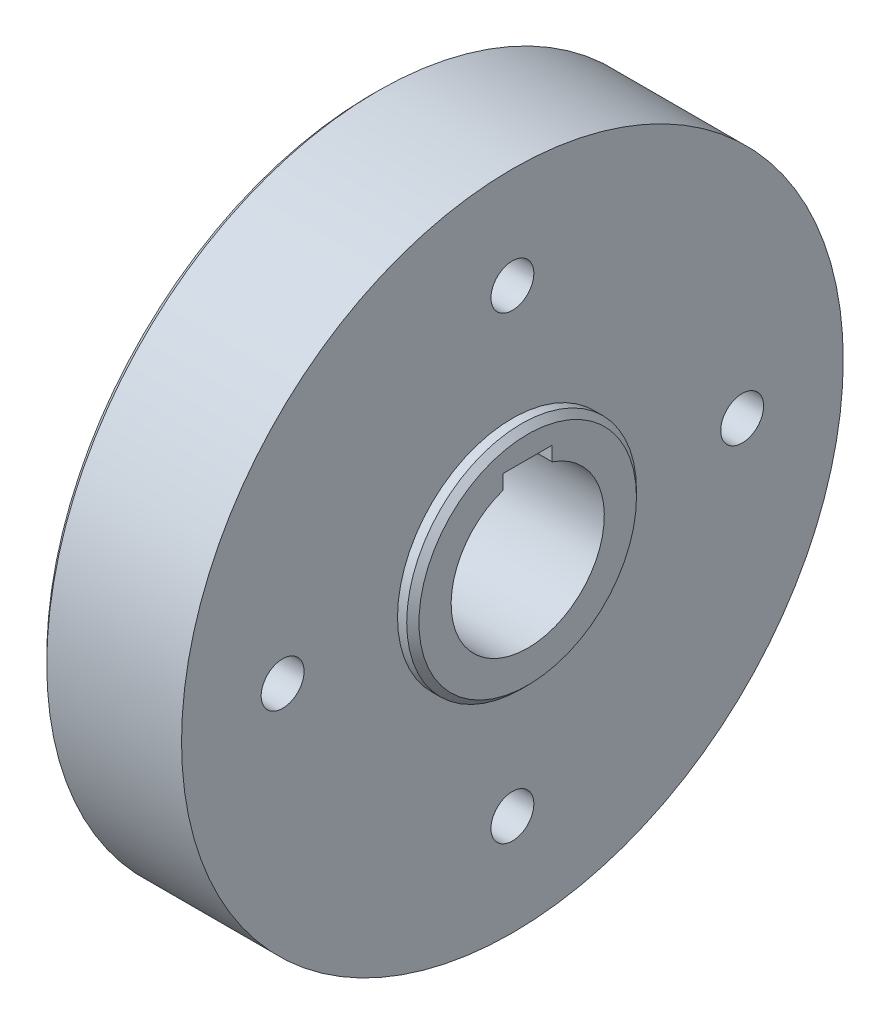
ISO-10303-21;
HEADER;
FILE_DESCRIPTION(('STEP AP214'),'2;1');
FILE_NAME('part.step','',(''),(''),'','','');
FILE_SCHEMA(('AUTOMOTIVE_DESIGN { 1 0 10303 214 1 1 1 1 }'));
ENDSEC;
DATA;
#1=APPLICATION_CONTEXT('core data for automotive mechanical design processes');
#2=APPLICATION_PROTOCOL_DEFINITION('international standard','automotive_design',2000,#1);
#3=PRODUCT_CONTEXT('',#1,'mechanical');
#4=PRODUCT('Part','Part','',(#3));
#5=PRODUCT_RELATED_PRODUCT_CATEGORY('part','',(#4));
#6=PRODUCT_DEFINITION_FORMATION('','',#4);
#7=PRODUCT_DEFINITION_CONTEXT('part definition',#1,'design');
#8=PRODUCT_DEFINITION('design','',#6,#7);
#9=PRODUCT_DEFINITION_SHAPE('','',#8);
#10=(LENGTH_UNIT() NAMED_UNIT(*) SI_UNIT(.MILLI.,.METRE.));
#11=(NAMED_UNIT(*) PLANE_ANGLE_UNIT() SI_UNIT($,.RADIAN.));
#12=(NAMED_UNIT(*) SI_UNIT($,.STERADIAN.) SOLID_ANGLE_UNIT());
#13=UNCERTAINTY_MEASURE_WITH_UNIT(LENGTH_MEASURE(1.E-05),#10,'distance_accuracy_value','');
#14=(GEOMETRIC_REPRESENTATION_CONTEXT(3) GLOBAL_UNCERTAINTY_ASSIGNED_CONTEXT((#13)) GLOBAL_UNIT_ASSIGNED_CONTEXT((#10,
#11,#12)) REPRESENTATION_CONTEXT('',''));
#15=CARTESIAN_POINT('',(0.,0.,0.));
#16=DIRECTION('',(0.,0.,1.));
#17=DIRECTION('',(1.,0.,0.));
#18=AXIS2_PLACEMENT_3D('',#15,#16,#17);
#19=CARTESIAN_POINT('',(15.,0.,0.));
#20=DIRECTION('',(1.,0.,0.));
#21=DIRECTION('',(0.,0.,-1.));
#22=AXIS2_PLACEMENT_3D('',#19,#20,#21);
#23=PLANE('',#22);
#24=CARTESIAN_POINT('',(15.,0.,0.));
#25=DIRECTION('',(1.,0.,0.));
#26=DIRECTION('',(0.,0.,-1.));
#27=AXIS2_PLACEMENT_3D('',#24,#25,#26);
#28=CIRCLE('',#27,52.);
#29=CARTESIAN_POINT('',(15.,0.,-52.));
#30=VERTEX_POINT('',#29);
#31=EDGE_CURVE('E163',#30,#30,#28,.T.);
#32=ORIENTED_EDGE('',*,*,#31,.T.);
#33=EDGE_LOOP('',(#32));
#34=FACE_BOUND('',#33,.T.);
#35=CARTESIAN_POINT('',(15.,0.,75.));
#36=DIRECTION('',(1.,0.,0.));
#37=DIRECTION('',(0.,0.,-1.));
#38=AXIS2_PLACEMENT_3D('',#35,#36,#37);
#39=CIRCLE('',#38,6.99999999999997);
#40=CARTESIAN_POINT('',(15.,0.,68.));
#41=VERTEX_POINT('',#40);
#42=EDGE_CURVE('E138',#41,#41,#39,.T.);
#43=ORIENTED_EDGE('',*,*,#42,.T.);
#44=EDGE_LOOP('',(#43));
#45=FACE_BOUND('',#44,.T.);
#46=CARTESIAN_POINT('',(15.,-75.,0.));
#47=DIRECTION('',(1.,0.,0.));
#48=DIRECTION('',(0.,0.,-1.));
#49=AXIS2_PLACEMENT_3D('',#46,#47,#48);
#50=CIRCLE('',#49,6.99999999999996);
#51=CARTESIAN_POINT('',(15.,-75.,-6.99999999999995));
#52=VERTEX_POINT('',#51);
#53=EDGE_CURVE('E134',#52,#52,#50,.T.);
#54=ORIENTED_EDGE('',*,*,#53,.T.);
#55=EDGE_LOOP('',(#54));
#56=FACE_BOUND('',#55,.T.);
#57=CARTESIAN_POINT('',(15.,0.,-75.));
#58=DIRECTION('',(1.,0.,0.));
#59=DIRECTION('',(0.,0.,-1.));
#60=AXIS2_PLACEMENT_3D('',#57,#58,#59);
#61=CIRCLE('',#60,6.99999999999997);
#62=CARTESIAN_POINT('',(15.,0.,-81.9999999999999));
#63=VERTEX_POINT('',#62);
#64=EDGE_CURVE('E128',#63,#63,#61,.T.);
#65=ORIENTED_EDGE('',*,*,#64,.T.);
#66=EDGE_LOOP('',(#65));
#67=FACE_BOUND('',#66,.T.);
#68=CARTESIAN_POINT('',(15.,75.,0.));
#69=DIRECTION('',(1.,0.,0.));
#70=DIRECTION('',(0.,0.,-1.));
#71=AXIS2_PLACEMENT_3D('',#68,#69,#70);
#72=CIRCLE('',#71,6.99999999999996);
#73=CARTESIAN_POINT('',(15.,75.,-6.99999999999996));
#74=VERTEX_POINT('',#73);
#75=EDGE_CURVE('E122',#74,#74,#72,.T.);
#76=ORIENTED_EDGE('',*,*,#75,.T.);
#77=EDGE_LOOP('',(#76));
#78=FACE_BOUND('',#77,.T.);
#79=CARTESIAN_POINT('',(15.,0.,0.));
#80=DIRECTION('',(1.,0.,0.));
#81=DIRECTION('',(0.,0.,-1.));
#82=AXIS2_PLACEMENT_3D('',#79,#80,#81);
#83=CIRCLE('',#82,100.);
#84=CARTESIAN_POINT('',(15.,0.,-100.));
#85=VERTEX_POINT('',#84);
#86=EDGE_CURVE('E150',#85,#85,#83,.T.);
#87=ORIENTED_EDGE('',*,*,#86,.F.);
#88=EDGE_LOOP('',(#87));
#89=FACE_BOUND('',#88,.T.);
#90=ADVANCED_FACE('F48',(#34,#45,#56,#67,#78,#89),#23,.F.);
#91=CARTESIAN_POINT('',(-40.,0.,0.));
#92=DIRECTION('',(-1.,0.,0.));
#93=DIRECTION('',(0.,0.,1.));
#94=AXIS2_PLACEMENT_3D('',#91,#92,#93);
#95=CYLINDRICAL_SURFACE('',#94,25.);
#96=DIRECTION('',(-1.,0.,0.));
#97=VECTOR('',#96,1.);
#98=CARTESIAN_POINT('',(-40.,23.685438564654,-8.));
#99=LINE('',#98,#97);
#100=CARTESIAN_POINT('',(-40.,23.685438564654,-8.));
#101=VERTEX_POINT('',#100);
#102=CARTESIAN_POINT('',(45.,23.685438564654,-8.));
#103=VERTEX_POINT('',#102);
#104=EDGE_CURVE('E72',#101,#103,#99,.F.);
#105=ORIENTED_EDGE('',*,*,#104,.F.);
#106=CARTESIAN_POINT('',(-40.,0.,0.));
#107=DIRECTION('',(-1.,0.,0.));
#108=DIRECTION('',(0.,0.,1.));
#109=AXIS2_PLACEMENT_3D('',#106,#107,#108);
#110=CIRCLE('',#109,25.);
#111=CARTESIAN_POINT('',(-40.,23.685438564654,8.));
#112=VERTEX_POINT('',#111);
#113=EDGE_CURVE('E139',#101,#112,#110,.T.);
#114=ORIENTED_EDGE('',*,*,#113,.T.);
#115=DIRECTION('',(-1.,0.,0.));
#116=VECTOR('',#115,1.);
#117=CARTESIAN_POINT('',(-40.,23.685438564654,8.));
#118=LINE('',#117,#116);
#119=CARTESIAN_POINT('',(45.,23.685438564654,8.));
#120=VERTEX_POINT('',#119);
#121=EDGE_CURVE('E64',#112,#120,#118,.F.);
#122=ORIENTED_EDGE('',*,*,#121,.T.);
#123=CARTESIAN_POINT('',(45.,0.,0.));
#124=DIRECTION('',(-1.,0.,0.));
#125=DIRECTION('',(0.,0.,1.));
#126=AXIS2_PLACEMENT_3D('',#123,#124,#125);
#127=CIRCLE('',#126,25.);
#128=EDGE_CURVE('E148',#103,#120,#127,.T.);
#129=ORIENTED_EDGE('',*,*,#128,.F.);
#130=EDGE_LOOP('',(#105,#114,#122,#129));
#131=FACE_BOUND('',#130,.T.);
#132=ADVANCED_FACE('F190',(#131),#95,.F.);
#133=CARTESIAN_POINT('',(45.,0.,0.));
#134=DIRECTION('',(1.,0.,0.));
#135=DIRECTION('',(0.,0.,-1.));
#136=AXIS2_PLACEMENT_3D('',#133,#134,#135);
#137=PLANE('',#136);
#138=CARTESIAN_POINT('',(45.,0.,0.));
#139=DIRECTION('',(1.,0.,0.));
#140=DIRECTION('',(0.,0.,-1.));
#141=AXIS2_PLACEMENT_3D('',#138,#139,#140);
#142=CIRCLE('',#141,35.4999999999999);
#143=CARTESIAN_POINT('',(45.,0.,-35.4999999999999));
#144=VERTEX_POINT('',#143);
#145=EDGE_CURVE('E169',#144,#144,#142,.T.);
#146=ORIENTED_EDGE('',*,*,#145,.T.);
#147=EDGE_LOOP('',(#146));
#148=FACE_BOUND('',#147,.T.);
#149=DIRECTION('',(0.,1.,0.));
#150=VECTOR('',#149,1.);
#151=CARTESIAN_POINT('',(45.,0.,-8.));
#152=LINE('',#151,#150);
#153=CARTESIAN_POINT('',(45.,28.4,-8.));
#154=VERTEX_POINT('',#153);
#155=EDGE_CURVE('E88',#103,#154,#152,.T.);
#156=ORIENTED_EDGE('',*,*,#155,.F.);
#157=ORIENTED_EDGE('',*,*,#128,.T.);
#158=DIRECTION('',(0.,1.,0.));
#159=VECTOR('',#158,1.);
#160=CARTESIAN_POINT('',(45.,0.,8.));
#161=LINE('',#160,#159);
#162=CARTESIAN_POINT('',(45.,28.4,8.));
#163=VERTEX_POINT('',#162);
#164=EDGE_CURVE('E109',#120,#163,#161,.T.);
#165=ORIENTED_EDGE('',*,*,#164,.T.);
#166=DIRECTION('',(0.,0.,1.));
#167=VECTOR('',#166,1.);
#168=CARTESIAN_POINT('',(45.,28.4,-8.));
#169=LINE('',#168,#167);
#170=EDGE_CURVE('E102',#154,#163,#169,.T.);
#171=ORIENTED_EDGE('',*,*,#170,.F.);
#172=EDGE_LOOP('',(#156,#157,#165,#171));
#173=FACE_BOUND('',#172,.T.);
#174=ADVANCED_FACE('F108',(#148,#173),#137,.T.);
#175=CARTESIAN_POINT('',(-40.,0.,0.));
#176=DIRECTION('',(-1.,0.,0.));
#177=DIRECTION('',(0.,0.,1.));
#178=AXIS2_PLACEMENT_3D('',#175,#176,#177);
#179=CYLINDRICAL_SURFACE('',#178,37.5);
#180=CARTESIAN_POINT('',(42.9999999999999,0.,0.));
#181=DIRECTION('',(1.,0.,0.));
#182=DIRECTION('',(0.,0.,-1.));
#183=AXIS2_PLACEMENT_3D('',#180,#181,#182);
#184=CIRCLE('',#183,37.5);
#185=CARTESIAN_POINT('',(42.9999999999999,0.,-37.5));
#186=VERTEX_POINT('',#185);
#187=EDGE_CURVE('E166',#186,#186,#184,.F.);
#188=ORIENTED_EDGE('',*,*,#187,.T.);
#189=EDGE_LOOP('',(#188));
#190=FACE_BOUND('',#189,.T.);
#191=CARTESIAN_POINT('',(40.,0.,0.));
#192=DIRECTION('',(-1.,0.,0.));
#193=DIRECTION('',(0.,0.,1.));
#194=AXIS2_PLACEMENT_3D('',#191,#192,#193);
#195=CIRCLE('',#194,37.5);
#196=CARTESIAN_POINT('',(40.,0.,37.5));
#197=VERTEX_POINT('',#196);
#198=EDGE_CURVE('E145',#197,#197,#195,.T.);
#199=ORIENTED_EDGE('',*,*,#198,.F.);
#200=EDGE_LOOP('',(#199));
#201=FACE_BOUND('',#200,.T.);
#202=ADVANCED_FACE('F210',(#190,#201),#179,.T.);
#203=CARTESIAN_POINT('',(40.,0.,0.));
#204=DIRECTION('',(1.,0.,0.));
#205=DIRECTION('',(0.,0.,-1.));
#206=AXIS2_PLACEMENT_3D('',#203,#204,#205);
#207=PLANE('',#206);
#208=CARTESIAN_POINT('',(40.,75.,0.));
#209=DIRECTION('',(1.,0.,0.));
#210=DIRECTION('',(0.,0.,-1.));
#211=AXIS2_PLACEMENT_3D('',#208,#209,#210);
#212=CIRCLE('',#211,6.99999999999996);
#213=CARTESIAN_POINT('',(40.,75.,-6.99999999999996));
#214=VERTEX_POINT('',#213);
#215=EDGE_CURVE('E119',#214,#214,#212,.T.);
#216=ORIENTED_EDGE('',*,*,#215,.F.);
#217=EDGE_LOOP('',(#216));
#218=FACE_BOUND('',#217,.T.);
#219=CARTESIAN_POINT('',(40.,0.,-75.));
#220=DIRECTION('',(1.,0.,0.));
#221=DIRECTION('',(0.,0.,-1.));
#222=AXIS2_PLACEMENT_3D('',#219,#220,#221);
#223=CIRCLE('',#222,6.99999999999997);
#224=CARTESIAN_POINT('',(40.,0.,-81.9999999999999));
#225=VERTEX_POINT('',#224);
#226=EDGE_CURVE('E125',#225,#225,#223,.T.);
#227=ORIENTED_EDGE('',*,*,#226,.F.);
#228=EDGE_LOOP('',(#227));
#229=FACE_BOUND('',#228,.T.);
#230=CARTESIAN_POINT('',(40.,-75.,0.));
#231=DIRECTION('',(1.,0.,0.));
#232=DIRECTION('',(0.,0.,-1.));
#233=AXIS2_PLACEMENT_3D('',#230,#231,#232);
#234=CIRCLE('',#233,6.99999999999996);
#235=CARTESIAN_POINT('',(40.,-75.,-6.99999999999995));
#236=VERTEX_POINT('',#235);
#237=EDGE_CURVE('E131',#236,#236,#234,.T.);
#238=ORIENTED_EDGE('',*,*,#237,.F.);
#239=EDGE_LOOP('',(#238));
#240=FACE_BOUND('',#239,.T.);
#241=CARTESIAN_POINT('',(40.,0.,75.));
#242=DIRECTION('',(1.,0.,0.));
#243=DIRECTION('',(0.,0.,-1.));
#244=AXIS2_PLACEMENT_3D('',#241,#242,#243);
#245=CIRCLE('',#244,6.99999999999997);
#246=CARTESIAN_POINT('',(40.,0.,68.));
#247=VERTEX_POINT('',#246);
#248=EDGE_CURVE('E135',#247,#247,#245,.T.);
#249=ORIENTED_EDGE('',*,*,#248,.F.);
#250=EDGE_LOOP('',(#249));
#251=FACE_BOUND('',#250,.T.);
#252=ORIENTED_EDGE('',*,*,#198,.T.);
#253=EDGE_LOOP('',(#252));
#254=FACE_BOUND('',#253,.T.);
#255=CARTESIAN_POINT('',(40.,0.,0.));
#256=DIRECTION('',(-1.,0.,0.));
#257=DIRECTION('',(0.,0.,1.));
#258=AXIS2_PLACEMENT_3D('',#255,#256,#257);
#259=CIRCLE('',#258,108.);
#260=CARTESIAN_POINT('',(40.,0.,108.));
#261=VERTEX_POINT('',#260);
#262=EDGE_CURVE('E142',#261,#261,#259,.T.);
#263=ORIENTED_EDGE('',*,*,#262,.F.);
#264=EDGE_LOOP('',(#263));
#265=FACE_BOUND('',#264,.T.);
#266=ADVANCED_FACE('F206',(#218,#229,#240,#251,#254,#265),#207,.T.);
#267=CARTESIAN_POINT('',(-40.,0.,0.));
#268=DIRECTION('',(-1.,0.,0.));
#269=DIRECTION('',(0.,0.,1.));
#270=AXIS2_PLACEMENT_3D('',#267,#268,#269);
#271=CYLINDRICAL_SURFACE('',#270,108.);
#272=CARTESIAN_POINT('',(-3.99999999999998,0.,0.));
#273=DIRECTION('',(1.,0.,0.));
#274=DIRECTION('',(0.,0.,-1.));
#275=AXIS2_PLACEMENT_3D('',#272,#273,#274);
#276=CIRCLE('',#275,108.);
#277=CARTESIAN_POINT('',(-3.99999999999998,0.,-108.));
#278=VERTEX_POINT('',#277);
#279=EDGE_CURVE('E11',#278,#278,#276,.T.);
#280=ORIENTED_EDGE('',*,*,#279,.T.);
#281=EDGE_LOOP('',(#280));
#282=FACE_BOUND('',#281,.T.);
#283=ORIENTED_EDGE('',*,*,#262,.T.);
#284=EDGE_LOOP('',(#283));
#285=FACE_BOUND('',#284,.T.);
#286=ADVANCED_FACE('F203',(#282,#285),#271,.T.);
#287=CARTESIAN_POINT('',(-40.,0.,0.));
#288=DIRECTION('',(-1.,0.,0.));
#289=DIRECTION('',(0.,0.,1.));
#290=AXIS2_PLACEMENT_3D('',#287,#288,#289);
#291=CYLINDRICAL_SURFACE('',#290,50.);
#292=CARTESIAN_POINT('',(12.9999999999999,0.,0.));
#293=DIRECTION('',(1.,0.,0.));
#294=DIRECTION('',(0.,0.,-1.));
#295=AXIS2_PLACEMENT_3D('',#292,#293,#294);
#296=CIRCLE('',#295,50.);
#297=CARTESIAN_POINT('',(12.9999999999999,0.,-50.));
#298=VERTEX_POINT('',#297);
#299=EDGE_CURVE('E160',#298,#298,#296,.F.);
#300=ORIENTED_EDGE('',*,*,#299,.T.);
#301=EDGE_LOOP('',(#300));
#302=FACE_BOUND('',#301,.T.);
#303=CARTESIAN_POINT('',(-38.0000000000001,0.,0.));
#304=DIRECTION('',(1.,0.,0.));
#305=DIRECTION('',(0.,0.,-1.));
#306=AXIS2_PLACEMENT_3D('',#303,#304,#305);
#307=CIRCLE('',#306,50.);
#308=CARTESIAN_POINT('',(-38.0000000000001,0.,-50.));
#309=VERTEX_POINT('',#308);
#310=EDGE_CURVE('E157',#309,#309,#307,.T.);
#311=ORIENTED_EDGE('',*,*,#310,.T.);
#312=EDGE_LOOP('',(#311));
#313=FACE_BOUND('',#312,.T.);
#314=ADVANCED_FACE('F201',(#302,#313),#291,.T.);
#315=CARTESIAN_POINT('',(-40.,0.,0.));
#316=DIRECTION('',(1.,0.,0.));
#317=DIRECTION('',(0.,0.,-1.));
#318=AXIS2_PLACEMENT_3D('',#315,#316,#317);
#319=PLANE('',#318);
#320=CARTESIAN_POINT('',(-40.,0.,0.));
#321=DIRECTION('',(1.,0.,0.));
#322=DIRECTION('',(0.,0.,-1.));
#323=AXIS2_PLACEMENT_3D('',#320,#321,#322);
#324=CIRCLE('',#323,48.0000000000001);
#325=CARTESIAN_POINT('',(-40.,0.,-48.0000000000001));
#326=VERTEX_POINT('',#325);
#327=EDGE_CURVE('E172',#326,#326,#324,.F.);
#328=ORIENTED_EDGE('',*,*,#327,.T.);
#329=EDGE_LOOP('',(#328));
#330=FACE_BOUND('',#329,.T.);
#331=ORIENTED_EDGE('',*,*,#113,.F.);
#332=DIRECTION('',(0.,-1.,0.));
#333=VECTOR('',#332,1.);
#334=CARTESIAN_POINT('',(-40.,0.,-8.));
#335=LINE('',#334,#333);
#336=CARTESIAN_POINT('',(-40.,27.55,-8.));
#337=VERTEX_POINT('',#336);
#338=EDGE_CURVE('E97',#337,#101,#335,.T.);
#339=ORIENTED_EDGE('',*,*,#338,.F.);
#340=DIRECTION('',(0.,0.,1.));
#341=VECTOR('',#340,1.);
#342=CARTESIAN_POINT('',(-40.,27.55,-8.));
#343=LINE('',#342,#341);
#344=CARTESIAN_POINT('',(-40.,27.55,8.));
#345=VERTEX_POINT('',#344);
#346=EDGE_CURVE('E105',#337,#345,#343,.T.);
#347=ORIENTED_EDGE('',*,*,#346,.T.);
#348=DIRECTION('',(0.,-1.,0.));
#349=VECTOR('',#348,1.);
#350=CARTESIAN_POINT('',(-40.,0.,8.));
#351=LINE('',#350,#349);
#352=EDGE_CURVE('E505',#345,#112,#351,.T.);
#353=ORIENTED_EDGE('',*,*,#352,.T.);
#354=EDGE_LOOP('',(#331,#339,#347,#353));
#355=FACE_BOUND('',#354,.T.);
#356=ADVANCED_FACE('F360',(#330,#355),#319,.F.);
#357=CARTESIAN_POINT('',(40.,0.,75.));
#358=DIRECTION('',(1.,0.,0.));
#359=DIRECTION('',(0.,0.,-1.));
#360=AXIS2_PLACEMENT_3D('',#357,#358,#359);
#361=CYLINDRICAL_SURFACE('',#360,6.99999999999997);
#362=ORIENTED_EDGE('',*,*,#248,.T.);
#363=EDGE_LOOP('',(#362));
#364=FACE_BOUND('',#363,.T.);
#365=ORIENTED_EDGE('',*,*,#42,.F.);
#366=EDGE_LOOP('',(#365));
#367=FACE_BOUND('',#366,.T.);
#368=ADVANCED_FACE('F350',(#364,#367),#361,.F.);
#369=CARTESIAN_POINT('',(40.,-75.,0.));
#370=DIRECTION('',(1.,0.,0.));
#371=DIRECTION('',(0.,0.,-1.));
#372=AXIS2_PLACEMENT_3D('',#369,#370,#371);
#373=CYLINDRICAL_SURFACE('',#372,6.99999999999996);
#374=ORIENTED_EDGE('',*,*,#237,.T.);
#375=EDGE_LOOP('',(#374));
#376=FACE_BOUND('',#375,.T.);
#377=ORIENTED_EDGE('',*,*,#53,.F.);
#378=EDGE_LOOP('',(#377));
#379=FACE_BOUND('',#378,.T.);
#380=ADVANCED_FACE('F340',(#376,#379),#373,.F.);
#381=CARTESIAN_POINT('',(40.,0.,-75.));
#382=DIRECTION('',(1.,0.,0.));
#383=DIRECTION('',(0.,0.,-1.));
#384=AXIS2_PLACEMENT_3D('',#381,#382,#383);
#385=CYLINDRICAL_SURFACE('',#384,6.99999999999997);
#386=ORIENTED_EDGE('',*,*,#226,.T.);
#387=EDGE_LOOP('',(#386));
#388=FACE_BOUND('',#387,.T.);
#389=ORIENTED_EDGE('',*,*,#64,.F.);
#390=EDGE_LOOP('',(#389));
#391=FACE_BOUND('',#390,.T.);
#392=ADVANCED_FACE('F330',(#388,#391),#385,.F.);
#393=CARTESIAN_POINT('',(40.,75.,0.));
#394=DIRECTION('',(1.,0.,0.));
#395=DIRECTION('',(0.,0.,-1.));
#396=AXIS2_PLACEMENT_3D('',#393,#394,#395);
#397=CYLINDRICAL_SURFACE('',#396,6.99999999999996);
#398=ORIENTED_EDGE('',*,*,#215,.T.);
#399=EDGE_LOOP('',(#398));
#400=FACE_BOUND('',#399,.T.);
#401=ORIENTED_EDGE('',*,*,#75,.F.);
#402=EDGE_LOOP('',(#401));
#403=FACE_BOUND('',#402,.T.);
#404=ADVANCED_FACE('F313',(#400,#403),#397,.F.);
#405=CARTESIAN_POINT('',(-5.99999999999998,108.,0.));
#406=DIRECTION('',(1.,0.,0.));
#407=DIRECTION('',(0.,0.,-1.));
#408=AXIS2_PLACEMENT_3D('',#405,#406,#407);
#409=PLANE('',#408);
#410=CARTESIAN_POINT('',(-5.99999999999998,0.,0.));
#411=DIRECTION('',(1.,0.,0.));
#412=DIRECTION('',(0.,0.,-1.));
#413=AXIS2_PLACEMENT_3D('',#410,#411,#412);
#414=CIRCLE('',#413,106.);
#415=CARTESIAN_POINT('',(-5.99999999999998,0.,-106.));
#416=VERTEX_POINT('',#415);
#417=EDGE_CURVE('E57',#416,#416,#414,.F.);
#418=ORIENTED_EDGE('',*,*,#417,.T.);
#419=EDGE_LOOP('',(#418));
#420=FACE_BOUND('',#419,.T.);
#421=CARTESIAN_POINT('',(-5.99999999999998,0.,0.));
#422=DIRECTION('',(-1.,0.,0.));
#423=DIRECTION('',(0.,0.,1.));
#424=AXIS2_PLACEMENT_3D('',#421,#422,#423);
#425=CIRCLE('',#424,100.);
#426=CARTESIAN_POINT('',(-5.99999999999998,0.,100.));
#427=VERTEX_POINT('',#426);
#428=EDGE_CURVE('E116',#427,#427,#425,.T.);
#429=ORIENTED_EDGE('',*,*,#428,.F.);
#430=EDGE_LOOP('',(#429));
#431=FACE_BOUND('',#430,.T.);
#432=ADVANCED_FACE('F177',(#420,#431),#409,.F.);
#433=CARTESIAN_POINT('',(0.,0.,0.));
#434=DIRECTION('',(-1.,0.,0.));
#435=DIRECTION('',(0.,0.,1.));
#436=AXIS2_PLACEMENT_3D('',#433,#434,#435);
#437=CYLINDRICAL_SURFACE('',#436,100.);
#438=ORIENTED_EDGE('',*,*,#86,.T.);
#439=EDGE_LOOP('',(#438));
#440=FACE_BOUND('',#439,.T.);
#441=ORIENTED_EDGE('',*,*,#428,.T.);
#442=EDGE_LOOP('',(#441));
#443=FACE_BOUND('',#442,.T.);
#444=ADVANCED_FACE('F295',(#440,#443),#437,.F.);
#445=CARTESIAN_POINT('',(-40.,27.55,-8.));
#446=DIRECTION('',(-0.00999950003749684,0.999950003749688,0.));
#447=DIRECTION('',(-0.999950003749688,-0.00999950003749684,0.));
#448=AXIS2_PLACEMENT_3D('',#445,#446,#447);
#449=PLANE('',#448);
#450=DIRECTION('',(-0.999950003749688,-0.00999950003749684,0.));
#451=VECTOR('',#450,1.);
#452=CARTESIAN_POINT('',(-40.,27.55,8.));
#453=LINE('',#452,#451);
#454=EDGE_CURVE('E507',#163,#345,#453,.T.);
#455=ORIENTED_EDGE('',*,*,#454,.T.);
#456=ORIENTED_EDGE('',*,*,#346,.F.);
#457=DIRECTION('',(-0.999950003749688,-0.00999950003749684,0.));
#458=VECTOR('',#457,1.);
#459=CARTESIAN_POINT('',(-40.,27.55,-8.));
#460=LINE('',#459,#458);
#461=EDGE_CURVE('E91',#154,#337,#460,.T.);
#462=ORIENTED_EDGE('',*,*,#461,.F.);
#463=ORIENTED_EDGE('',*,*,#170,.T.);
#464=EDGE_LOOP('',(#455,#456,#462,#463));
#465=FACE_BOUND('',#464,.T.);
#466=ADVANCED_FACE('F101',(#465),#449,.F.);
#467=CARTESIAN_POINT('',(0.,0.,-8.));
#468=DIRECTION('',(0.,0.,-1.));
#469=DIRECTION('',(-1.,0.,0.));
#470=AXIS2_PLACEMENT_3D('',#467,#468,#469);
#471=PLANE('',#470);
#472=ORIENTED_EDGE('',*,*,#104,.T.);
#473=ORIENTED_EDGE('',*,*,#155,.T.);
#474=ORIENTED_EDGE('',*,*,#461,.T.);
#475=ORIENTED_EDGE('',*,*,#338,.T.);
#476=EDGE_LOOP('',(#472,#473,#474,#475));
#477=FACE_BOUND('',#476,.T.);
#478=ADVANCED_FACE('F90',(#477),#471,.F.);
#479=CARTESIAN_POINT('',(0.,0.,8.));
#480=DIRECTION('',(0.,0.,-1.));
#481=DIRECTION('',(-1.,0.,0.));
#482=AXIS2_PLACEMENT_3D('',#479,#480,#481);
#483=PLANE('',#482);
#484=ORIENTED_EDGE('',*,*,#352,.F.);
#485=ORIENTED_EDGE('',*,*,#454,.F.);
#486=ORIENTED_EDGE('',*,*,#164,.F.);
#487=ORIENTED_EDGE('',*,*,#121,.F.);
#488=EDGE_LOOP('',(#484,#485,#486,#487));
#489=FACE_BOUND('',#488,.T.);
#490=ADVANCED_FACE('F225',(#489),#483,.T.);
#491=CARTESIAN_POINT('',(12.9999999999999,0.,0.));
#492=DIRECTION('',(1.,0.,0.));
#493=DIRECTION('',(0.,0.,-1.));
#494=AXIS2_PLACEMENT_3D('',#491,#492,#493);
#495=CONICAL_SURFACE('',#494,50.,0.78539816339744);
#496=ORIENTED_EDGE('',*,*,#31,.F.);
#497=EDGE_LOOP('',(#496));
#498=FACE_BOUND('',#497,.T.);
#499=ORIENTED_EDGE('',*,*,#299,.F.);
#500=EDGE_LOOP('',(#499));
#501=FACE_BOUND('',#500,.T.);
#502=ADVANCED_FACE('F219',(#498,#501),#495,.T.);
#503=CARTESIAN_POINT('',(42.9999999999999,0.,0.));
#504=DIRECTION('',(-1.,0.,0.));
#505=DIRECTION('',(0.,0.,1.));
#506=AXIS2_PLACEMENT_3D('',#503,#504,#505);
#507=CONICAL_SURFACE('',#506,37.5,0.785398163397454);
#508=ORIENTED_EDGE('',*,*,#145,.F.);
#509=EDGE_LOOP('',(#508));
#510=FACE_BOUND('',#509,.T.);
#511=ORIENTED_EDGE('',*,*,#187,.F.);
#512=EDGE_LOOP('',(#511));
#513=FACE_BOUND('',#512,.T.);
#514=ADVANCED_FACE('F186',(#510,#513),#507,.T.);
#515=CARTESIAN_POINT('',(-40.,0.,0.));
#516=DIRECTION('',(1.,0.,0.));
#517=DIRECTION('',(0.,0.,-1.));
#518=AXIS2_PLACEMENT_3D('',#515,#516,#517);
#519=CONICAL_SURFACE('',#518,48.0000000000001,0.785398163397447);
#520=ORIENTED_EDGE('',*,*,#310,.F.);
#521=EDGE_LOOP('',(#520));
#522=FACE_BOUND('',#521,.T.);
#523=ORIENTED_EDGE('',*,*,#327,.F.);
#524=EDGE_LOOP('',(#523));
#525=FACE_BOUND('',#524,.T.);
#526=ADVANCED_FACE('F181',(#522,#525),#519,.T.);
#527=CARTESIAN_POINT('',(-5.99999999999998,0.,0.));
#528=DIRECTION('',(1.,0.,0.));
#529=DIRECTION('',(0.,0.,-1.));
#530=AXIS2_PLACEMENT_3D('',#527,#528,#529);
#531=CONICAL_SURFACE('',#530,106.,0.785398163397448);
#532=ORIENTED_EDGE('',*,*,#279,.F.);
#533=EDGE_LOOP('',(#532));
#534=FACE_BOUND('',#533,.T.);
#535=ORIENTED_EDGE('',*,*,#417,.F.);
#536=EDGE_LOOP('',(#535));
#537=FACE_BOUND('',#536,.T.);
#538=ADVANCED_FACE('F51',(#534,#537),#531,.T.);
#539=CLOSED_SHELL('',(#90,#132,#174,#202,#266,#286,#314,#356,#368,#380,#392,#404,#432,#444,#466,
#478,#490,#502,#514,#526,#538));
#540=MANIFOLD_SOLID_BREP('B2',#539);
#541=ADVANCED_BREP_SHAPE_REPRESENTATION('',(#18,#540),#14);
#542=SHAPE_DEFINITION_REPRESENTATION(#9,#541);
ENDSEC;
END-ISO-10303-21;
